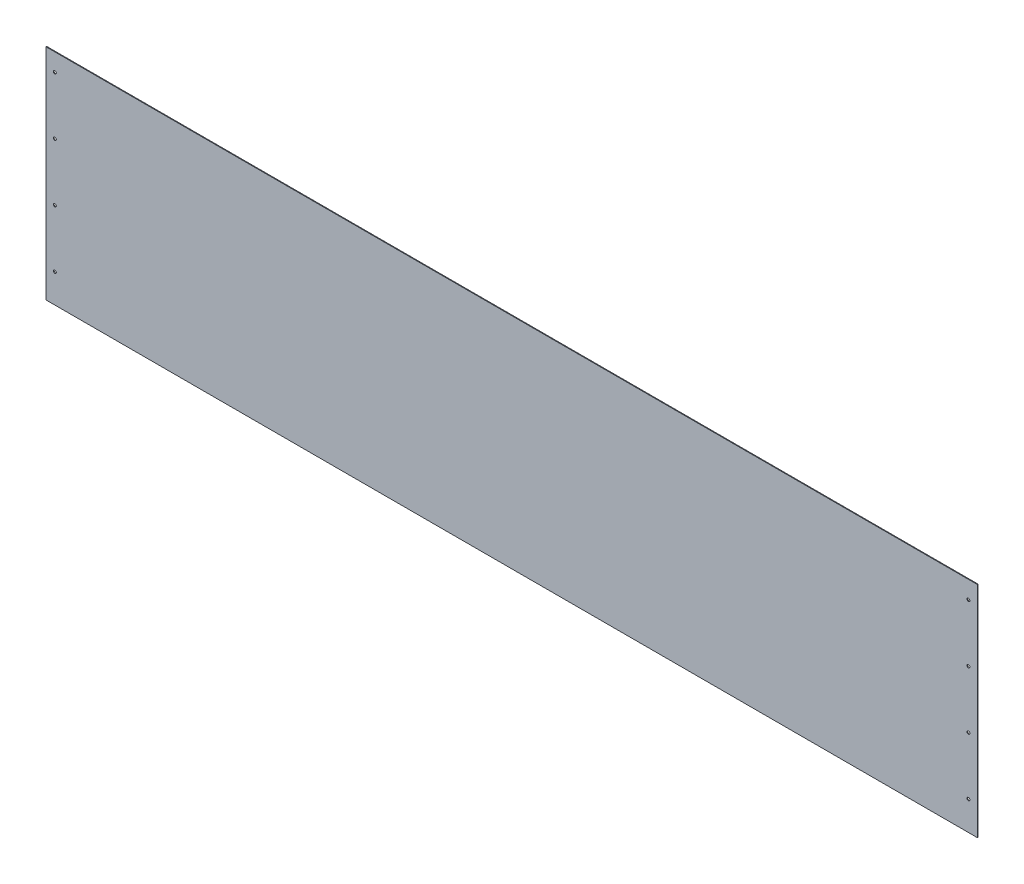
ISO-10303-21;
HEADER;
FILE_DESCRIPTION(('STEP AP214'),'2;1');
FILE_NAME('part.step','',(''),(''),'','','');
FILE_SCHEMA(('AUTOMOTIVE_DESIGN { 1 0 10303 214 1 1 1 1 }'));
ENDSEC;
DATA;
#1=APPLICATION_CONTEXT('core data for automotive mechanical design processes');
#2=APPLICATION_PROTOCOL_DEFINITION('international standard','automotive_design',2000,#1);
#3=PRODUCT_CONTEXT('',#1,'mechanical');
#4=PRODUCT('Part','Part','',(#3));
#5=PRODUCT_RELATED_PRODUCT_CATEGORY('part','',(#4));
#6=PRODUCT_DEFINITION_FORMATION('','',#4);
#7=PRODUCT_DEFINITION_CONTEXT('part definition',#1,'design');
#8=PRODUCT_DEFINITION('design','',#6,#7);
#9=PRODUCT_DEFINITION_SHAPE('','',#8);
#10=(LENGTH_UNIT() NAMED_UNIT(*) SI_UNIT(.MILLI.,.METRE.));
#11=(NAMED_UNIT(*) PLANE_ANGLE_UNIT() SI_UNIT($,.RADIAN.));
#12=(NAMED_UNIT(*) SI_UNIT($,.STERADIAN.) SOLID_ANGLE_UNIT());
#13=UNCERTAINTY_MEASURE_WITH_UNIT(LENGTH_MEASURE(1.E-05),#10,'distance_accuracy_value','');
#14=(GEOMETRIC_REPRESENTATION_CONTEXT(3) GLOBAL_UNCERTAINTY_ASSIGNED_CONTEXT((#13)) GLOBAL_UNIT_ASSIGNED_CONTEXT((#10,
#11,#12)) REPRESENTATION_CONTEXT('',''));
#15=CARTESIAN_POINT('',(0.,0.,0.));
#16=DIRECTION('',(0.,0.,1.));
#17=DIRECTION('',(1.,0.,0.));
#18=AXIS2_PLACEMENT_3D('',#15,#16,#17);
#19=CARTESIAN_POINT('',(1051.99,-247.7,-1.5875));
#20=DIRECTION('',(1.,0.,0.));
#21=DIRECTION('',(0.,0.,-1.));
#22=AXIS2_PLACEMENT_3D('',#19,#20,#21);
#23=PLANE('',#22);
#24=DIRECTION('',(0.,1.,0.));
#25=VECTOR('',#24,1.);
#26=CARTESIAN_POINT('',(1051.99,-247.7,0.));
#27=LINE('',#26,#25);
#28=CARTESIAN_POINT('',(1051.99,-247.7,0.));
#29=VERTEX_POINT('',#28);
#30=CARTESIAN_POINT('',(1051.99,247.7,0.));
#31=VERTEX_POINT('',#30);
#32=EDGE_CURVE('E105',#29,#31,#27,.T.);
#33=ORIENTED_EDGE('',*,*,#32,.F.);
#34=DIRECTION('',(0.,0.,1.));
#35=VECTOR('',#34,1.);
#36=CARTESIAN_POINT('',(1051.99,-247.7,-1.5875));
#37=LINE('',#36,#35);
#38=CARTESIAN_POINT('',(1051.99,-247.7,-1.5875));
#39=VERTEX_POINT('',#38);
#40=EDGE_CURVE('E11',#39,#29,#37,.T.);
#41=ORIENTED_EDGE('',*,*,#40,.F.);
#42=DIRECTION('',(0.,1.,0.));
#43=VECTOR('',#42,1.);
#44=CARTESIAN_POINT('',(1051.99,-247.7,-1.5875));
#45=LINE('',#44,#43);
#46=CARTESIAN_POINT('',(1051.99,247.7,-1.5875));
#47=VERTEX_POINT('',#46);
#48=EDGE_CURVE('E98',#39,#47,#45,.T.);
#49=ORIENTED_EDGE('',*,*,#48,.T.);
#50=DIRECTION('',(0.,0.,1.));
#51=VECTOR('',#50,1.);
#52=CARTESIAN_POINT('',(1051.99,247.7,-1.5875));
#53=LINE('',#52,#51);
#54=EDGE_CURVE('E43',#47,#31,#53,.T.);
#55=ORIENTED_EDGE('',*,*,#54,.T.);
#56=EDGE_LOOP('',(#33,#41,#49,#55));
#57=FACE_BOUND('',#56,.T.);
#58=ADVANCED_FACE('F40',(#57),#23,.T.);
#59=CARTESIAN_POINT('',(-1051.99,-247.7,-1.5875));
#60=DIRECTION('',(0.,-1.,0.));
#61=DIRECTION('',(0.,0.,-1.));
#62=AXIS2_PLACEMENT_3D('',#59,#60,#61);
#63=PLANE('',#62);
#64=DIRECTION('',(1.,0.,0.));
#65=VECTOR('',#64,1.);
#66=CARTESIAN_POINT('',(-1051.99,-247.7,0.));
#67=LINE('',#66,#65);
#68=CARTESIAN_POINT('',(-1051.99,-247.7,0.));
#69=VERTEX_POINT('',#68);
#70=EDGE_CURVE('E100',#69,#29,#67,.T.);
#71=ORIENTED_EDGE('',*,*,#70,.F.);
#72=DIRECTION('',(0.,0.,1.));
#73=VECTOR('',#72,1.);
#74=CARTESIAN_POINT('',(-1051.99,-247.7,-1.5875));
#75=LINE('',#74,#73);
#76=CARTESIAN_POINT('',(-1051.99,-247.7,-1.5875));
#77=VERTEX_POINT('',#76);
#78=EDGE_CURVE('E49',#77,#69,#75,.T.);
#79=ORIENTED_EDGE('',*,*,#78,.F.);
#80=DIRECTION('',(1.,0.,0.));
#81=VECTOR('',#80,1.);
#82=CARTESIAN_POINT('',(-1051.99,-247.7,-1.5875));
#83=LINE('',#82,#81);
#84=EDGE_CURVE('E95',#77,#39,#83,.T.);
#85=ORIENTED_EDGE('',*,*,#84,.T.);
#86=ORIENTED_EDGE('',*,*,#40,.T.);
#87=EDGE_LOOP('',(#71,#79,#85,#86));
#88=FACE_BOUND('',#87,.T.);
#89=ADVANCED_FACE('F116',(#88),#63,.T.);
#90=CARTESIAN_POINT('',(-1051.99,-247.7,-1.5875));
#91=DIRECTION('',(-1.,0.,0.));
#92=DIRECTION('',(0.,0.,1.));
#93=AXIS2_PLACEMENT_3D('',#90,#91,#92);
#94=PLANE('',#93);
#95=DIRECTION('',(0.,-1.,0.));
#96=VECTOR('',#95,1.);
#97=CARTESIAN_POINT('',(-1051.99,-247.7,0.));
#98=LINE('',#97,#96);
#99=CARTESIAN_POINT('',(-1051.99,247.7,0.));
#100=VERTEX_POINT('',#99);
#101=EDGE_CURVE('E90',#100,#69,#98,.T.);
#102=ORIENTED_EDGE('',*,*,#101,.F.);
#103=DIRECTION('',(0.,0.,1.));
#104=VECTOR('',#103,1.);
#105=CARTESIAN_POINT('',(-1051.99,247.7,-1.5875));
#106=LINE('',#105,#104);
#107=CARTESIAN_POINT('',(-1051.99,247.7,-1.5875));
#108=VERTEX_POINT('',#107);
#109=EDGE_CURVE('E85',#108,#100,#106,.T.);
#110=ORIENTED_EDGE('',*,*,#109,.F.);
#111=DIRECTION('',(0.,-1.,0.));
#112=VECTOR('',#111,1.);
#113=CARTESIAN_POINT('',(-1051.99,-247.7,-1.5875));
#114=LINE('',#113,#112);
#115=EDGE_CURVE('E88',#108,#77,#114,.T.);
#116=ORIENTED_EDGE('',*,*,#115,.T.);
#117=ORIENTED_EDGE('',*,*,#78,.T.);
#118=EDGE_LOOP('',(#102,#110,#116,#117));
#119=FACE_BOUND('',#118,.T.);
#120=ADVANCED_FACE('F87',(#119),#94,.T.);
#121=CARTESIAN_POINT('',(-1051.99,247.7,-1.5875));
#122=DIRECTION('',(0.,1.,0.));
#123=DIRECTION('',(0.,0.,1.));
#124=AXIS2_PLACEMENT_3D('',#121,#122,#123);
#125=PLANE('',#124);
#126=DIRECTION('',(-1.,0.,0.));
#127=VECTOR('',#126,1.);
#128=CARTESIAN_POINT('',(-1051.99,247.7,0.));
#129=LINE('',#128,#127);
#130=EDGE_CURVE('E108',#31,#100,#129,.T.);
#131=ORIENTED_EDGE('',*,*,#130,.F.);
#132=ORIENTED_EDGE('',*,*,#54,.F.);
#133=DIRECTION('',(-1.,0.,0.));
#134=VECTOR('',#133,1.);
#135=CARTESIAN_POINT('',(-1051.99,247.7,-1.5875));
#136=LINE('',#135,#134);
#137=EDGE_CURVE('E94',#47,#108,#136,.T.);
#138=ORIENTED_EDGE('',*,*,#137,.T.);
#139=ORIENTED_EDGE('',*,*,#109,.T.);
#140=EDGE_LOOP('',(#131,#132,#138,#139));
#141=FACE_BOUND('',#140,.T.);
#142=ADVANCED_FACE('F97',(#141),#125,.T.);
#143=CARTESIAN_POINT('',(0.,0.,-1.5875));
#144=DIRECTION('',(0.,0.,-1.));
#145=DIRECTION('',(-1.,0.,0.));
#146=AXIS2_PLACEMENT_3D('',#143,#144,#145);
#147=PLANE('',#146);
#148=CARTESIAN_POINT('',(1031.99,207.7,-1.5875));
#149=DIRECTION('',(0.,0.,-1.));
#150=DIRECTION('',(-1.,0.,0.));
#151=AXIS2_PLACEMENT_3D('',#148,#149,#150);
#152=CIRCLE('',#151,3.30000000000008);
#153=CARTESIAN_POINT('',(1028.69,207.7,-1.5875));
#154=VERTEX_POINT('',#153);
#155=EDGE_CURVE('E176',#154,#154,#152,.T.);
#156=ORIENTED_EDGE('',*,*,#155,.F.);
#157=EDGE_LOOP('',(#156));
#158=FACE_BOUND('',#157,.T.);
#159=CARTESIAN_POINT('',(1031.99,77.7,-1.5875));
#160=DIRECTION('',(0.,0.,-1.));
#161=DIRECTION('',(-1.,0.,0.));
#162=AXIS2_PLACEMENT_3D('',#159,#160,#161);
#163=CIRCLE('',#162,3.30000000000008);
#164=CARTESIAN_POINT('',(1028.69,77.7,-1.5875));
#165=VERTEX_POINT('',#164);
#166=EDGE_CURVE('E178',#165,#165,#163,.T.);
#167=ORIENTED_EDGE('',*,*,#166,.F.);
#168=EDGE_LOOP('',(#167));
#169=FACE_BOUND('',#168,.T.);
#170=CARTESIAN_POINT('',(1031.99,-52.3,-1.5875));
#171=DIRECTION('',(0.,0.,-1.));
#172=DIRECTION('',(-1.,0.,0.));
#173=AXIS2_PLACEMENT_3D('',#170,#171,#172);
#174=CIRCLE('',#173,3.30000000000008);
#175=CARTESIAN_POINT('',(1028.69,-52.3,-1.5875));
#176=VERTEX_POINT('',#175);
#177=EDGE_CURVE('E186',#176,#176,#174,.T.);
#178=ORIENTED_EDGE('',*,*,#177,.F.);
#179=EDGE_LOOP('',(#178));
#180=FACE_BOUND('',#179,.T.);
#181=CARTESIAN_POINT('',(1031.99,-182.3,-1.5875));
#182=DIRECTION('',(0.,0.,-1.));
#183=DIRECTION('',(-1.,0.,0.));
#184=AXIS2_PLACEMENT_3D('',#181,#182,#183);
#185=CIRCLE('',#184,3.30000000000008);
#186=CARTESIAN_POINT('',(1028.69,-182.3,-1.5875));
#187=VERTEX_POINT('',#186);
#188=EDGE_CURVE('E192',#187,#187,#185,.T.);
#189=ORIENTED_EDGE('',*,*,#188,.F.);
#190=EDGE_LOOP('',(#189));
#191=FACE_BOUND('',#190,.T.);
#192=CARTESIAN_POINT('',(-1031.99,-182.3,-1.5875));
#193=DIRECTION('',(0.,0.,-1.));
#194=DIRECTION('',(-1.,0.,0.));
#195=AXIS2_PLACEMENT_3D('',#192,#193,#194);
#196=CIRCLE('',#195,3.30000000000008);
#197=CARTESIAN_POINT('',(-1035.29,-182.3,-1.5875));
#198=VERTEX_POINT('',#197);
#199=EDGE_CURVE('E198',#198,#198,#196,.T.);
#200=ORIENTED_EDGE('',*,*,#199,.F.);
#201=EDGE_LOOP('',(#200));
#202=FACE_BOUND('',#201,.T.);
#203=CARTESIAN_POINT('',(-1031.99,-52.2999999999998,-1.5875));
#204=DIRECTION('',(0.,0.,-1.));
#205=DIRECTION('',(-1.,0.,0.));
#206=AXIS2_PLACEMENT_3D('',#203,#204,#205);
#207=CIRCLE('',#206,3.30000000000008);
#208=CARTESIAN_POINT('',(-1035.29,-52.2999999999998,-1.5875));
#209=VERTEX_POINT('',#208);
#210=EDGE_CURVE('E204',#209,#209,#207,.T.);
#211=ORIENTED_EDGE('',*,*,#210,.F.);
#212=EDGE_LOOP('',(#211));
#213=FACE_BOUND('',#212,.T.);
#214=CARTESIAN_POINT('',(-1031.99,77.7000000000002,-1.5875));
#215=DIRECTION('',(0.,0.,-1.));
#216=DIRECTION('',(-1.,0.,0.));
#217=AXIS2_PLACEMENT_3D('',#214,#215,#216);
#218=CIRCLE('',#217,3.30000000000008);
#219=CARTESIAN_POINT('',(-1035.29,77.7000000000002,-1.5875));
#220=VERTEX_POINT('',#219);
#221=EDGE_CURVE('E210',#220,#220,#218,.T.);
#222=ORIENTED_EDGE('',*,*,#221,.F.);
#223=EDGE_LOOP('',(#222));
#224=FACE_BOUND('',#223,.T.);
#225=CARTESIAN_POINT('',(-1031.99,207.7,-1.5875));
#226=DIRECTION('',(0.,0.,-1.));
#227=DIRECTION('',(-1.,0.,0.));
#228=AXIS2_PLACEMENT_3D('',#225,#226,#227);
#229=CIRCLE('',#228,3.30000000000008);
#230=CARTESIAN_POINT('',(-1035.29,207.7,-1.5875));
#231=VERTEX_POINT('',#230);
#232=EDGE_CURVE('E216',#231,#231,#229,.T.);
#233=ORIENTED_EDGE('',*,*,#232,.F.);
#234=EDGE_LOOP('',(#233));
#235=FACE_BOUND('',#234,.T.);
#236=ORIENTED_EDGE('',*,*,#48,.F.);
#237=ORIENTED_EDGE('',*,*,#84,.F.);
#238=ORIENTED_EDGE('',*,*,#115,.F.);
#239=ORIENTED_EDGE('',*,*,#137,.F.);
#240=EDGE_LOOP('',(#236,#237,#238,#239));
#241=FACE_BOUND('',#240,.T.);
#242=ADVANCED_FACE('F93',(#158,#169,#180,#191,#202,#213,#224,#235,#241),#147,.T.);
#243=CARTESIAN_POINT('',(0.,0.,0.));
#244=DIRECTION('',(0.,0.,-1.));
#245=DIRECTION('',(-1.,0.,0.));
#246=AXIS2_PLACEMENT_3D('',#243,#244,#245);
#247=PLANE('',#246);
#248=CARTESIAN_POINT('',(1031.99,207.7,0.));
#249=DIRECTION('',(0.,0.,-1.));
#250=DIRECTION('',(-1.,0.,0.));
#251=AXIS2_PLACEMENT_3D('',#248,#249,#250);
#252=CIRCLE('',#251,3.30000000000008);
#253=CARTESIAN_POINT('',(1028.69,207.7,0.));
#254=VERTEX_POINT('',#253);
#255=EDGE_CURVE('E174',#254,#254,#252,.T.);
#256=ORIENTED_EDGE('',*,*,#255,.T.);
#257=EDGE_LOOP('',(#256));
#258=FACE_BOUND('',#257,.T.);
#259=CARTESIAN_POINT('',(1031.99,77.7,0.));
#260=DIRECTION('',(0.,0.,-1.));
#261=DIRECTION('',(-1.,0.,0.));
#262=AXIS2_PLACEMENT_3D('',#259,#260,#261);
#263=CIRCLE('',#262,3.30000000000008);
#264=CARTESIAN_POINT('',(1028.69,77.7,0.));
#265=VERTEX_POINT('',#264);
#266=EDGE_CURVE('E183',#265,#265,#263,.T.);
#267=ORIENTED_EDGE('',*,*,#266,.T.);
#268=EDGE_LOOP('',(#267));
#269=FACE_BOUND('',#268,.T.);
#270=CARTESIAN_POINT('',(1031.99,-52.3,0.));
#271=DIRECTION('',(0.,0.,-1.));
#272=DIRECTION('',(-1.,0.,0.));
#273=AXIS2_PLACEMENT_3D('',#270,#271,#272);
#274=CIRCLE('',#273,3.30000000000008);
#275=CARTESIAN_POINT('',(1028.69,-52.3,0.));
#276=VERTEX_POINT('',#275);
#277=EDGE_CURVE('E189',#276,#276,#274,.T.);
#278=ORIENTED_EDGE('',*,*,#277,.T.);
#279=EDGE_LOOP('',(#278));
#280=FACE_BOUND('',#279,.T.);
#281=CARTESIAN_POINT('',(1031.99,-182.3,0.));
#282=DIRECTION('',(0.,0.,-1.));
#283=DIRECTION('',(-1.,0.,0.));
#284=AXIS2_PLACEMENT_3D('',#281,#282,#283);
#285=CIRCLE('',#284,3.30000000000008);
#286=CARTESIAN_POINT('',(1028.69,-182.3,0.));
#287=VERTEX_POINT('',#286);
#288=EDGE_CURVE('E195',#287,#287,#285,.T.);
#289=ORIENTED_EDGE('',*,*,#288,.T.);
#290=EDGE_LOOP('',(#289));
#291=FACE_BOUND('',#290,.T.);
#292=CARTESIAN_POINT('',(-1031.99,-182.3,0.));
#293=DIRECTION('',(0.,0.,-1.));
#294=DIRECTION('',(-1.,0.,0.));
#295=AXIS2_PLACEMENT_3D('',#292,#293,#294);
#296=CIRCLE('',#295,3.30000000000008);
#297=CARTESIAN_POINT('',(-1035.29,-182.3,0.));
#298=VERTEX_POINT('',#297);
#299=EDGE_CURVE('E201',#298,#298,#296,.T.);
#300=ORIENTED_EDGE('',*,*,#299,.T.);
#301=EDGE_LOOP('',(#300));
#302=FACE_BOUND('',#301,.T.);
#303=CARTESIAN_POINT('',(-1031.99,-52.2999999999998,0.));
#304=DIRECTION('',(0.,0.,-1.));
#305=DIRECTION('',(-1.,0.,0.));
#306=AXIS2_PLACEMENT_3D('',#303,#304,#305);
#307=CIRCLE('',#306,3.30000000000008);
#308=CARTESIAN_POINT('',(-1035.29,-52.2999999999998,0.));
#309=VERTEX_POINT('',#308);
#310=EDGE_CURVE('E207',#309,#309,#307,.T.);
#311=ORIENTED_EDGE('',*,*,#310,.T.);
#312=EDGE_LOOP('',(#311));
#313=FACE_BOUND('',#312,.T.);
#314=CARTESIAN_POINT('',(-1031.99,77.7000000000002,0.));
#315=DIRECTION('',(0.,0.,-1.));
#316=DIRECTION('',(-1.,0.,0.));
#317=AXIS2_PLACEMENT_3D('',#314,#315,#316);
#318=CIRCLE('',#317,3.30000000000008);
#319=CARTESIAN_POINT('',(-1035.29,77.7000000000002,0.));
#320=VERTEX_POINT('',#319);
#321=EDGE_CURVE('E213',#320,#320,#318,.T.);
#322=ORIENTED_EDGE('',*,*,#321,.T.);
#323=EDGE_LOOP('',(#322));
#324=FACE_BOUND('',#323,.T.);
#325=CARTESIAN_POINT('',(-1031.99,207.7,0.));
#326=DIRECTION('',(0.,0.,-1.));
#327=DIRECTION('',(-1.,0.,0.));
#328=AXIS2_PLACEMENT_3D('',#325,#326,#327);
#329=CIRCLE('',#328,3.30000000000008);
#330=CARTESIAN_POINT('',(-1035.29,207.7,0.));
#331=VERTEX_POINT('',#330);
#332=EDGE_CURVE('E109',#331,#331,#329,.T.);
#333=ORIENTED_EDGE('',*,*,#332,.T.);
#334=EDGE_LOOP('',(#333));
#335=FACE_BOUND('',#334,.T.);
#336=ORIENTED_EDGE('',*,*,#32,.T.);
#337=ORIENTED_EDGE('',*,*,#130,.T.);
#338=ORIENTED_EDGE('',*,*,#101,.T.);
#339=ORIENTED_EDGE('',*,*,#70,.T.);
#340=EDGE_LOOP('',(#336,#337,#338,#339));
#341=FACE_BOUND('',#340,.T.);
#342=ADVANCED_FACE('F115',(#258,#269,#280,#291,#302,#313,#324,#335,#341),#247,.F.);
#343=CARTESIAN_POINT('',(-1031.99,207.7,-1.5875));
#344=DIRECTION('',(0.,0.,-1.));
#345=DIRECTION('',(-1.,0.,0.));
#346=AXIS2_PLACEMENT_3D('',#343,#344,#345);
#347=CYLINDRICAL_SURFACE('',#346,3.30000000000008);
#348=ORIENTED_EDGE('',*,*,#332,.F.);
#349=EDGE_LOOP('',(#348));
#350=FACE_BOUND('',#349,.T.);
#351=ORIENTED_EDGE('',*,*,#232,.T.);
#352=EDGE_LOOP('',(#351));
#353=FACE_BOUND('',#352,.T.);
#354=ADVANCED_FACE('F134',(#350,#353),#347,.F.);
#355=CARTESIAN_POINT('',(-1031.99,77.7000000000002,-1.5875));
#356=DIRECTION('',(0.,0.,-1.));
#357=DIRECTION('',(-1.,0.,0.));
#358=AXIS2_PLACEMENT_3D('',#355,#356,#357);
#359=CYLINDRICAL_SURFACE('',#358,3.30000000000008);
#360=ORIENTED_EDGE('',*,*,#321,.F.);
#361=EDGE_LOOP('',(#360));
#362=FACE_BOUND('',#361,.T.);
#363=ORIENTED_EDGE('',*,*,#221,.T.);
#364=EDGE_LOOP('',(#363));
#365=FACE_BOUND('',#364,.T.);
#366=ADVANCED_FACE('F141',(#362,#365),#359,.F.);
#367=CARTESIAN_POINT('',(-1031.99,-52.2999999999998,-1.5875));
#368=DIRECTION('',(0.,0.,-1.));
#369=DIRECTION('',(-1.,0.,0.));
#370=AXIS2_PLACEMENT_3D('',#367,#368,#369);
#371=CYLINDRICAL_SURFACE('',#370,3.30000000000008);
#372=ORIENTED_EDGE('',*,*,#310,.F.);
#373=EDGE_LOOP('',(#372));
#374=FACE_BOUND('',#373,.T.);
#375=ORIENTED_EDGE('',*,*,#210,.T.);
#376=EDGE_LOOP('',(#375));
#377=FACE_BOUND('',#376,.T.);
#378=ADVANCED_FACE('F145',(#374,#377),#371,.F.);
#379=CARTESIAN_POINT('',(-1031.99,-182.3,-1.5875));
#380=DIRECTION('',(0.,0.,-1.));
#381=DIRECTION('',(-1.,0.,0.));
#382=AXIS2_PLACEMENT_3D('',#379,#380,#381);
#383=CYLINDRICAL_SURFACE('',#382,3.30000000000008);
#384=ORIENTED_EDGE('',*,*,#299,.F.);
#385=EDGE_LOOP('',(#384));
#386=FACE_BOUND('',#385,.T.);
#387=ORIENTED_EDGE('',*,*,#199,.T.);
#388=EDGE_LOOP('',(#387));
#389=FACE_BOUND('',#388,.T.);
#390=ADVANCED_FACE('F149',(#386,#389),#383,.F.);
#391=CARTESIAN_POINT('',(1031.99,-182.3,-1.5875));
#392=DIRECTION('',(0.,0.,-1.));
#393=DIRECTION('',(-1.,0.,0.));
#394=AXIS2_PLACEMENT_3D('',#391,#392,#393);
#395=CYLINDRICAL_SURFACE('',#394,3.30000000000008);
#396=ORIENTED_EDGE('',*,*,#288,.F.);
#397=EDGE_LOOP('',(#396));
#398=FACE_BOUND('',#397,.T.);
#399=ORIENTED_EDGE('',*,*,#188,.T.);
#400=EDGE_LOOP('',(#399));
#401=FACE_BOUND('',#400,.T.);
#402=ADVANCED_FACE('F153',(#398,#401),#395,.F.);
#403=CARTESIAN_POINT('',(1031.99,-52.3,-1.5875));
#404=DIRECTION('',(0.,0.,-1.));
#405=DIRECTION('',(-1.,0.,0.));
#406=AXIS2_PLACEMENT_3D('',#403,#404,#405);
#407=CYLINDRICAL_SURFACE('',#406,3.30000000000008);
#408=ORIENTED_EDGE('',*,*,#277,.F.);
#409=EDGE_LOOP('',(#408));
#410=FACE_BOUND('',#409,.T.);
#411=ORIENTED_EDGE('',*,*,#177,.T.);
#412=EDGE_LOOP('',(#411));
#413=FACE_BOUND('',#412,.T.);
#414=ADVANCED_FACE('F157',(#410,#413),#407,.F.);
#415=CARTESIAN_POINT('',(1031.99,77.7,-1.5875));
#416=DIRECTION('',(0.,0.,-1.));
#417=DIRECTION('',(-1.,0.,0.));
#418=AXIS2_PLACEMENT_3D('',#415,#416,#417);
#419=CYLINDRICAL_SURFACE('',#418,3.30000000000008);
#420=ORIENTED_EDGE('',*,*,#266,.F.);
#421=EDGE_LOOP('',(#420));
#422=FACE_BOUND('',#421,.T.);
#423=ORIENTED_EDGE('',*,*,#166,.T.);
#424=EDGE_LOOP('',(#423));
#425=FACE_BOUND('',#424,.T.);
#426=ADVANCED_FACE('F161',(#422,#425),#419,.F.);
#427=CARTESIAN_POINT('',(1031.99,207.7,-1.5875));
#428=DIRECTION('',(0.,0.,-1.));
#429=DIRECTION('',(-1.,0.,0.));
#430=AXIS2_PLACEMENT_3D('',#427,#428,#429);
#431=CYLINDRICAL_SURFACE('',#430,3.30000000000008);
#432=ORIENTED_EDGE('',*,*,#255,.F.);
#433=EDGE_LOOP('',(#432));
#434=FACE_BOUND('',#433,.T.);
#435=ORIENTED_EDGE('',*,*,#155,.T.);
#436=EDGE_LOOP('',(#435));
#437=FACE_BOUND('',#436,.T.);
#438=ADVANCED_FACE('F165',(#434,#437),#431,.F.);
#439=CLOSED_SHELL('',(#58,#89,#120,#142,#242,#342,#354,#366,#378,#390,#402,#414,#426,#438));
#440=MANIFOLD_SOLID_BREP('B2',#439);
#441=ADVANCED_BREP_SHAPE_REPRESENTATION('',(#18,#440),#14);
#442=SHAPE_DEFINITION_REPRESENTATION(#9,#441);
ENDSEC;
END-ISO-10303-21;
